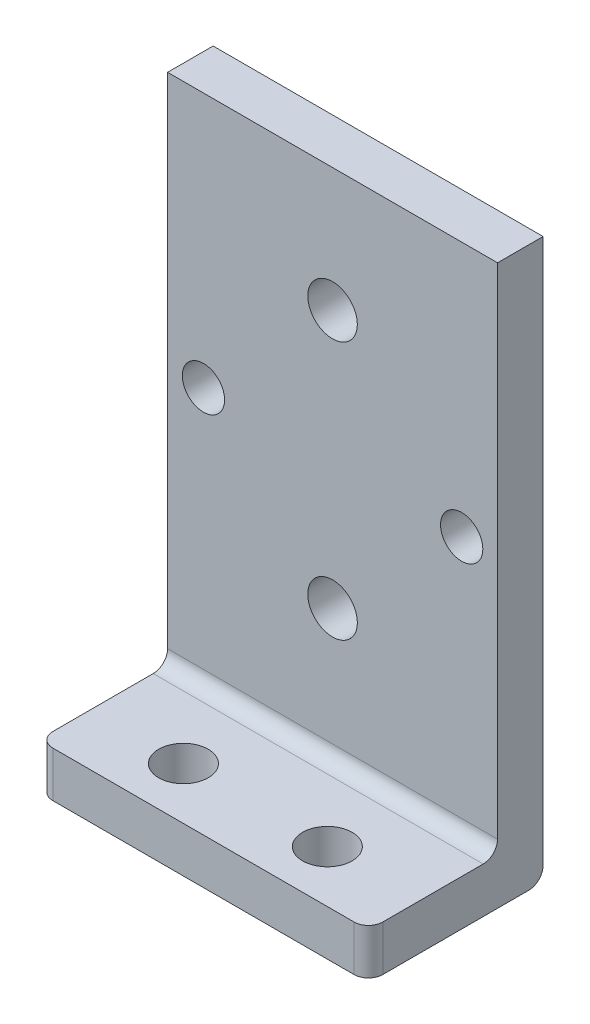
ISO-10303-21;
HEADER;
FILE_DESCRIPTION(('STEP AP214'),'2;1');
FILE_NAME('part.step','',(''),(''),'','','');
FILE_SCHEMA(('AUTOMOTIVE_DESIGN { 1 0 10303 214 1 1 1 1 }'));
ENDSEC;
DATA;
#1=APPLICATION_CONTEXT('core data for automotive mechanical design processes');
#2=APPLICATION_PROTOCOL_DEFINITION('international standard','automotive_design',2000,#1);
#3=PRODUCT_CONTEXT('',#1,'mechanical');
#4=PRODUCT('Part','Part','',(#3));
#5=PRODUCT_RELATED_PRODUCT_CATEGORY('part','',(#4));
#6=PRODUCT_DEFINITION_FORMATION('','',#4);
#7=PRODUCT_DEFINITION_CONTEXT('part definition',#1,'design');
#8=PRODUCT_DEFINITION('design','',#6,#7);
#9=PRODUCT_DEFINITION_SHAPE('','',#8);
#10=(LENGTH_UNIT() NAMED_UNIT(*) SI_UNIT(.MILLI.,.METRE.));
#11=(NAMED_UNIT(*) PLANE_ANGLE_UNIT() SI_UNIT($,.RADIAN.));
#12=(NAMED_UNIT(*) SI_UNIT($,.STERADIAN.) SOLID_ANGLE_UNIT());
#13=UNCERTAINTY_MEASURE_WITH_UNIT(LENGTH_MEASURE(1.E-05),#10,'distance_accuracy_value','');
#14=(GEOMETRIC_REPRESENTATION_CONTEXT(3) GLOBAL_UNCERTAINTY_ASSIGNED_CONTEXT((#13)) GLOBAL_UNIT_ASSIGNED_CONTEXT((#10,
#11,#12)) REPRESENTATION_CONTEXT('',''));
#15=CARTESIAN_POINT('',(0.,0.,0.));
#16=DIRECTION('',(0.,0.,1.));
#17=DIRECTION('',(1.,0.,0.));
#18=AXIS2_PLACEMENT_3D('',#15,#16,#17);
#19=CARTESIAN_POINT('',(23.,0.,3.175));
#20=DIRECTION('',(1.,0.,0.));
#21=DIRECTION('',(0.,1.,0.));
#22=AXIS2_PLACEMENT_3D('',#19,#20,#21);
#23=PLANE('',#22);
#24=DIRECTION('',(0.,0.,-1.));
#25=VECTOR('',#24,1.);
#26=CARTESIAN_POINT('',(23.,-20.,12.175));
#27=LINE('',#26,#25);
#28=CARTESIAN_POINT('',(23.,-20.,11.175));
#29=VERTEX_POINT('',#28);
#30=CARTESIAN_POINT('',(23.,-20.,4.175));
#31=VERTEX_POINT('',#30);
#32=EDGE_CURVE('E165',#29,#31,#27,.T.);
#33=ORIENTED_EDGE('',*,*,#32,.F.);
#34=DIRECTION('',(0.,1.,0.));
#35=VECTOR('',#34,1.);
#36=CARTESIAN_POINT('',(23.,0.,11.175));
#37=LINE('',#36,#35);
#38=CARTESIAN_POINT('',(23.,-23.175,11.175));
#39=VERTEX_POINT('',#38);
#40=EDGE_CURVE('E210',#29,#39,#37,.F.);
#41=ORIENTED_EDGE('',*,*,#40,.T.);
#42=DIRECTION('',(0.,0.,-1.));
#43=VECTOR('',#42,1.);
#44=CARTESIAN_POINT('',(23.,-23.175,3.175));
#45=LINE('',#44,#43);
#46=CARTESIAN_POINT('',(23.,-23.175,1.));
#47=VERTEX_POINT('',#46);
#48=EDGE_CURVE('E162',#39,#47,#45,.T.);
#49=ORIENTED_EDGE('',*,*,#48,.T.);
#50=CARTESIAN_POINT('',(23.,-22.175,1.));
#51=DIRECTION('',(1.,0.,0.));
#52=DIRECTION('',(0.,1.,0.));
#53=AXIS2_PLACEMENT_3D('',#50,#51,#52);
#54=CIRCLE('',#53,1.);
#55=CARTESIAN_POINT('',(23.,-22.175,0.));
#56=VERTEX_POINT('',#55);
#57=EDGE_CURVE('E60',#47,#56,#54,.T.);
#58=ORIENTED_EDGE('',*,*,#57,.T.);
#59=DIRECTION('',(0.,-1.,0.));
#60=VECTOR('',#59,1.);
#61=CARTESIAN_POINT('',(23.,0.,0.));
#62=LINE('',#61,#60);
#63=CARTESIAN_POINT('',(23.,15.7952076860709,0.));
#64=VERTEX_POINT('',#63);
#65=EDGE_CURVE('E125',#64,#56,#62,.T.);
#66=ORIENTED_EDGE('',*,*,#65,.F.);
#67=DIRECTION('',(0.,0.,-1.));
#68=VECTOR('',#67,1.);
#69=CARTESIAN_POINT('',(23.,15.7952076860709,3.175));
#70=LINE('',#69,#68);
#71=CARTESIAN_POINT('',(23.,15.7952076860709,3.175));
#72=VERTEX_POINT('',#71);
#73=EDGE_CURVE('E120',#72,#64,#70,.T.);
#74=ORIENTED_EDGE('',*,*,#73,.F.);
#75=DIRECTION('',(0.,-1.,0.));
#76=VECTOR('',#75,1.);
#77=CARTESIAN_POINT('',(23.,0.,3.175));
#78=LINE('',#77,#76);
#79=CARTESIAN_POINT('',(23.,-19.,3.175));
#80=VERTEX_POINT('',#79);
#81=EDGE_CURVE('E123',#72,#80,#78,.T.);
#82=ORIENTED_EDGE('',*,*,#81,.T.);
#83=CARTESIAN_POINT('',(23.,-19.,4.175));
#84=DIRECTION('',(1.,0.,0.));
#85=DIRECTION('',(0.,1.,0.));
#86=AXIS2_PLACEMENT_3D('',#83,#84,#85);
#87=CIRCLE('',#86,1.);
#88=EDGE_CURVE('E11',#80,#31,#87,.F.);
#89=ORIENTED_EDGE('',*,*,#88,.T.);
#90=EDGE_LOOP('',(#33,#41,#49,#58,#66,#74,#82,#89));
#91=FACE_BOUND('',#90,.T.);
#92=ADVANCED_FACE('F45',(#91),#23,.T.);
#93=CARTESIAN_POINT('',(0.,15.7952076860709,3.175));
#94=DIRECTION('',(0.,1.,0.));
#95=DIRECTION('',(0.,0.,1.));
#96=AXIS2_PLACEMENT_3D('',#93,#94,#95);
#97=PLANE('',#96);
#98=DIRECTION('',(1.,0.,0.));
#99=VECTOR('',#98,1.);
#100=CARTESIAN_POINT('',(0.,15.7952076860709,0.));
#101=LINE('',#100,#99);
#102=CARTESIAN_POINT('',(0.,15.7952076860709,0.));
#103=VERTEX_POINT('',#102);
#104=EDGE_CURVE('E164',#103,#64,#101,.T.);
#105=ORIENTED_EDGE('',*,*,#104,.F.);
#106=DIRECTION('',(0.,0.,-1.));
#107=VECTOR('',#106,1.);
#108=CARTESIAN_POINT('',(0.,15.7952076860709,3.175));
#109=LINE('',#108,#107);
#110=CARTESIAN_POINT('',(0.,15.7952076860709,3.175));
#111=VERTEX_POINT('',#110);
#112=EDGE_CURVE('E131',#111,#103,#109,.T.);
#113=ORIENTED_EDGE('',*,*,#112,.F.);
#114=DIRECTION('',(1.,0.,0.));
#115=VECTOR('',#114,1.);
#116=CARTESIAN_POINT('',(0.,15.7952076860709,3.175));
#117=LINE('',#116,#115);
#118=EDGE_CURVE('E138',#111,#72,#117,.T.);
#119=ORIENTED_EDGE('',*,*,#118,.T.);
#120=ORIENTED_EDGE('',*,*,#73,.T.);
#121=EDGE_LOOP('',(#105,#113,#119,#120));
#122=FACE_BOUND('',#121,.T.);
#123=ADVANCED_FACE('F143',(#122),#97,.T.);
#124=CARTESIAN_POINT('',(0.,0.,3.175));
#125=DIRECTION('',(1.,0.,0.));
#126=DIRECTION('',(0.,1.,0.));
#127=AXIS2_PLACEMENT_3D('',#124,#125,#126);
#128=PLANE('',#127);
#129=DIRECTION('',(0.,0.,-1.));
#130=VECTOR('',#129,1.);
#131=CARTESIAN_POINT('',(0.,-23.175,3.175));
#132=LINE('',#131,#130);
#133=CARTESIAN_POINT('',(0.,-23.175,11.175));
#134=VERTEX_POINT('',#133);
#135=CARTESIAN_POINT('',(0.,-23.175,1.));
#136=VERTEX_POINT('',#135);
#137=EDGE_CURVE('E182',#134,#136,#132,.T.);
#138=ORIENTED_EDGE('',*,*,#137,.F.);
#139=DIRECTION('',(0.,1.,0.));
#140=VECTOR('',#139,1.);
#141=CARTESIAN_POINT('',(0.,-20.,11.175));
#142=LINE('',#141,#140);
#143=CARTESIAN_POINT('',(0.,-20.,11.175));
#144=VERTEX_POINT('',#143);
#145=EDGE_CURVE('E195',#134,#144,#142,.T.);
#146=ORIENTED_EDGE('',*,*,#145,.T.);
#147=DIRECTION('',(0.,0.,-1.));
#148=VECTOR('',#147,1.);
#149=CARTESIAN_POINT('',(0.,-20.,12.175));
#150=LINE('',#149,#148);
#151=CARTESIAN_POINT('',(0.,-20.,4.175));
#152=VERTEX_POINT('',#151);
#153=EDGE_CURVE('E218',#144,#152,#150,.T.);
#154=ORIENTED_EDGE('',*,*,#153,.T.);
#155=CARTESIAN_POINT('',(0.,-19.,4.175));
#156=DIRECTION('',(1.,0.,0.));
#157=DIRECTION('',(0.,1.,0.));
#158=AXIS2_PLACEMENT_3D('',#155,#156,#157);
#159=CIRCLE('',#158,1.);
#160=CARTESIAN_POINT('',(0.,-19.,3.175));
#161=VERTEX_POINT('',#160);
#162=EDGE_CURVE('E53',#152,#161,#159,.T.);
#163=ORIENTED_EDGE('',*,*,#162,.T.);
#164=DIRECTION('',(0.,-1.,0.));
#165=VECTOR('',#164,1.);
#166=CARTESIAN_POINT('',(0.,0.,3.175));
#167=LINE('',#166,#165);
#168=EDGE_CURVE('E145',#111,#161,#167,.T.);
#169=ORIENTED_EDGE('',*,*,#168,.F.);
#170=ORIENTED_EDGE('',*,*,#112,.T.);
#171=DIRECTION('',(0.,-1.,0.));
#172=VECTOR('',#171,1.);
#173=CARTESIAN_POINT('',(0.,0.,0.));
#174=LINE('',#173,#172);
#175=CARTESIAN_POINT('',(0.,-22.175,0.));
#176=VERTEX_POINT('',#175);
#177=EDGE_CURVE('E167',#103,#176,#174,.T.);
#178=ORIENTED_EDGE('',*,*,#177,.T.);
#179=CARTESIAN_POINT('',(0.,-22.175,1.));
#180=DIRECTION('',(1.,0.,0.));
#181=DIRECTION('',(0.,1.,0.));
#182=AXIS2_PLACEMENT_3D('',#179,#180,#181);
#183=CIRCLE('',#182,1.);
#184=EDGE_CURVE('E193',#176,#136,#183,.F.);
#185=ORIENTED_EDGE('',*,*,#184,.T.);
#186=EDGE_LOOP('',(#138,#146,#154,#163,#169,#170,#178,#185));
#187=FACE_BOUND('',#186,.T.);
#188=ADVANCED_FACE('F216',(#187),#128,.F.);
#189=CARTESIAN_POINT('',(2.5,-2.,3.175));
#190=DIRECTION('',(0.,0.,-1.));
#191=DIRECTION('',(-1.,0.,0.));
#192=AXIS2_PLACEMENT_3D('',#189,#190,#191);
#193=CYLINDRICAL_SURFACE('',#192,1.4732);
#194=CARTESIAN_POINT('',(2.5,-2.,3.175));
#195=DIRECTION('',(0.,0.,1.));
#196=DIRECTION('',(1.,0.,0.));
#197=AXIS2_PLACEMENT_3D('',#194,#195,#196);
#198=CIRCLE('',#197,1.4732);
#199=CARTESIAN_POINT('',(3.9732,-2.,3.175));
#200=VERTEX_POINT('',#199);
#201=EDGE_CURVE('E156',#200,#200,#198,.T.);
#202=ORIENTED_EDGE('',*,*,#201,.T.);
#203=EDGE_LOOP('',(#202));
#204=FACE_BOUND('',#203,.T.);
#205=CARTESIAN_POINT('',(2.5,-2.,0.));
#206=DIRECTION('',(0.,0.,1.));
#207=DIRECTION('',(1.,0.,0.));
#208=AXIS2_PLACEMENT_3D('',#205,#206,#207);
#209=CIRCLE('',#208,1.4732);
#210=CARTESIAN_POINT('',(3.9732,-2.,0.));
#211=VERTEX_POINT('',#210);
#212=EDGE_CURVE('E176',#211,#211,#209,.T.);
#213=ORIENTED_EDGE('',*,*,#212,.F.);
#214=EDGE_LOOP('',(#213));
#215=FACE_BOUND('',#214,.T.);
#216=ADVANCED_FACE('F325',(#204,#215),#193,.F.);
#217=CARTESIAN_POINT('',(20.5,-2.,3.175));
#218=DIRECTION('',(0.,0.,-1.));
#219=DIRECTION('',(-1.,0.,0.));
#220=AXIS2_PLACEMENT_3D('',#217,#218,#219);
#221=CYLINDRICAL_SURFACE('',#220,1.4732);
#222=CARTESIAN_POINT('',(20.5,-2.,3.175));
#223=DIRECTION('',(0.,0.,1.));
#224=DIRECTION('',(1.,0.,0.));
#225=AXIS2_PLACEMENT_3D('',#222,#223,#224);
#226=CIRCLE('',#225,1.4732);
#227=CARTESIAN_POINT('',(21.9732,-2.,3.175));
#228=VERTEX_POINT('',#227);
#229=EDGE_CURVE('E153',#228,#228,#226,.T.);
#230=ORIENTED_EDGE('',*,*,#229,.T.);
#231=EDGE_LOOP('',(#230));
#232=FACE_BOUND('',#231,.T.);
#233=CARTESIAN_POINT('',(20.5,-2.,0.));
#234=DIRECTION('',(0.,0.,1.));
#235=DIRECTION('',(1.,0.,0.));
#236=AXIS2_PLACEMENT_3D('',#233,#234,#235);
#237=CIRCLE('',#236,1.4732);
#238=CARTESIAN_POINT('',(21.9732,-2.,0.));
#239=VERTEX_POINT('',#238);
#240=EDGE_CURVE('E173',#239,#239,#237,.T.);
#241=ORIENTED_EDGE('',*,*,#240,.F.);
#242=EDGE_LOOP('',(#241));
#243=FACE_BOUND('',#242,.T.);
#244=ADVANCED_FACE('F328',(#232,#243),#221,.F.);
#245=CARTESIAN_POINT('',(11.5,-10.8179043102955,3.175));
#246=DIRECTION('',(0.,0.,-1.));
#247=DIRECTION('',(-1.,0.,0.));
#248=AXIS2_PLACEMENT_3D('',#245,#246,#247);
#249=CYLINDRICAL_SURFACE('',#248,1.7272);
#250=CARTESIAN_POINT('',(11.5,-10.8179043102955,3.175));
#251=DIRECTION('',(0.,0.,1.));
#252=DIRECTION('',(1.,0.,0.));
#253=AXIS2_PLACEMENT_3D('',#250,#251,#252);
#254=CIRCLE('',#253,1.7272);
#255=CARTESIAN_POINT('',(13.2272,-10.8179043102955,3.175));
#256=VERTEX_POINT('',#255);
#257=EDGE_CURVE('E147',#256,#256,#254,.T.);
#258=ORIENTED_EDGE('',*,*,#257,.T.);
#259=EDGE_LOOP('',(#258));
#260=FACE_BOUND('',#259,.T.);
#261=CARTESIAN_POINT('',(11.5,-10.8179043102955,0.));
#262=DIRECTION('',(0.,0.,1.));
#263=DIRECTION('',(1.,0.,0.));
#264=AXIS2_PLACEMENT_3D('',#261,#262,#263);
#265=CIRCLE('',#264,1.7272);
#266=CARTESIAN_POINT('',(13.2272,-10.8179043102955,0.));
#267=VERTEX_POINT('',#266);
#268=EDGE_CURVE('E170',#267,#267,#265,.T.);
#269=ORIENTED_EDGE('',*,*,#268,.F.);
#270=EDGE_LOOP('',(#269));
#271=FACE_BOUND('',#270,.T.);
#272=ADVANCED_FACE('F321',(#260,#271),#249,.F.);
#273=CARTESIAN_POINT('',(0.,-23.175,3.175));
#274=DIRECTION('',(0.,1.,0.));
#275=DIRECTION('',(0.,0.,1.));
#276=AXIS2_PLACEMENT_3D('',#273,#274,#275);
#277=PLANE('',#276);
#278=CARTESIAN_POINT('',(6.4835,-23.175,8.5555));
#279=DIRECTION('',(0.,1.,0.));
#280=DIRECTION('',(0.,0.,1.));
#281=AXIS2_PLACEMENT_3D('',#278,#279,#280);
#282=CIRCLE('',#281,1.7272);
#283=CARTESIAN_POINT('',(6.4835,-23.175,10.2827));
#284=VERTEX_POINT('',#283);
#285=EDGE_CURVE('E241',#284,#284,#282,.T.);
#286=ORIENTED_EDGE('',*,*,#285,.T.);
#287=EDGE_LOOP('',(#286));
#288=FACE_BOUND('',#287,.T.);
#289=CARTESIAN_POINT('',(16.5165,-23.175,8.5555));
#290=DIRECTION('',(0.,1.,0.));
#291=DIRECTION('',(0.,0.,1.));
#292=AXIS2_PLACEMENT_3D('',#289,#290,#291);
#293=CIRCLE('',#292,1.7272);
#294=CARTESIAN_POINT('',(16.5165,-23.175,10.2827));
#295=VERTEX_POINT('',#294);
#296=EDGE_CURVE('E235',#295,#295,#293,.T.);
#297=ORIENTED_EDGE('',*,*,#296,.T.);
#298=EDGE_LOOP('',(#297));
#299=FACE_BOUND('',#298,.T.);
#300=DIRECTION('',(-1.,0.,0.));
#301=VECTOR('',#300,1.);
#302=CARTESIAN_POINT('',(0.,-23.175,12.175));
#303=LINE('',#302,#301);
#304=CARTESIAN_POINT('',(22.,-23.175,12.175));
#305=VERTEX_POINT('',#304);
#306=CARTESIAN_POINT('',(1.,-23.175,12.175));
#307=VERTEX_POINT('',#306);
#308=EDGE_CURVE('E228',#305,#307,#303,.T.);
#309=ORIENTED_EDGE('',*,*,#308,.T.);
#310=CARTESIAN_POINT('',(1.,-23.175,11.175));
#311=DIRECTION('',(0.,1.,0.));
#312=DIRECTION('',(0.,0.,1.));
#313=AXIS2_PLACEMENT_3D('',#310,#311,#312);
#314=CIRCLE('',#313,1.);
#315=EDGE_CURVE('E207',#307,#134,#314,.F.);
#316=ORIENTED_EDGE('',*,*,#315,.T.);
#317=ORIENTED_EDGE('',*,*,#137,.T.);
#318=DIRECTION('',(1.,0.,0.));
#319=VECTOR('',#318,1.);
#320=CARTESIAN_POINT('',(0.,-23.175,1.));
#321=LINE('',#320,#319);
#322=EDGE_CURVE('E203',#136,#47,#321,.T.);
#323=ORIENTED_EDGE('',*,*,#322,.T.);
#324=ORIENTED_EDGE('',*,*,#48,.F.);
#325=CARTESIAN_POINT('',(22.,-23.175,11.175));
#326=DIRECTION('',(0.,1.,0.));
#327=DIRECTION('',(0.,0.,1.));
#328=AXIS2_PLACEMENT_3D('',#325,#326,#327);
#329=CIRCLE('',#328,1.);
#330=EDGE_CURVE('E205',#39,#305,#329,.F.);
#331=ORIENTED_EDGE('',*,*,#330,.T.);
#332=EDGE_LOOP('',(#309,#316,#317,#323,#324,#331));
#333=FACE_BOUND('',#332,.T.);
#334=ADVANCED_FACE('F294',(#288,#299,#333),#277,.F.);
#335=CARTESIAN_POINT('',(11.5,7.18209568970453,3.175));
#336=DIRECTION('',(0.,0.,-1.));
#337=DIRECTION('',(-1.,0.,0.));
#338=AXIS2_PLACEMENT_3D('',#335,#336,#337);
#339=CYLINDRICAL_SURFACE('',#338,1.7272);
#340=CARTESIAN_POINT('',(11.5,7.18209568970453,3.175));
#341=DIRECTION('',(0.,0.,1.));
#342=DIRECTION('',(1.,0.,0.));
#343=AXIS2_PLACEMENT_3D('',#340,#341,#342);
#344=CIRCLE('',#343,1.7272);
#345=CARTESIAN_POINT('',(13.2272,7.18209568970453,3.175));
#346=VERTEX_POINT('',#345);
#347=EDGE_CURVE('E159',#346,#346,#344,.T.);
#348=ORIENTED_EDGE('',*,*,#347,.T.);
#349=EDGE_LOOP('',(#348));
#350=FACE_BOUND('',#349,.T.);
#351=CARTESIAN_POINT('',(11.5,7.18209568970453,0.));
#352=DIRECTION('',(0.,0.,1.));
#353=DIRECTION('',(1.,0.,0.));
#354=AXIS2_PLACEMENT_3D('',#351,#352,#353);
#355=CIRCLE('',#354,1.7272);
#356=CARTESIAN_POINT('',(13.2272,7.18209568970453,0.));
#357=VERTEX_POINT('',#356);
#358=EDGE_CURVE('E141',#357,#357,#355,.T.);
#359=ORIENTED_EDGE('',*,*,#358,.F.);
#360=EDGE_LOOP('',(#359));
#361=FACE_BOUND('',#360,.T.);
#362=ADVANCED_FACE('F312',(#350,#361),#339,.F.);
#363=CARTESIAN_POINT('',(0.,0.,3.175));
#364=DIRECTION('',(0.,0.,1.));
#365=DIRECTION('',(1.,0.,0.));
#366=AXIS2_PLACEMENT_3D('',#363,#364,#365);
#367=PLANE('',#366);
#368=ORIENTED_EDGE('',*,*,#168,.T.);
#369=DIRECTION('',(-1.,0.,0.));
#370=VECTOR('',#369,1.);
#371=CARTESIAN_POINT('',(0.,-19.,3.175));
#372=LINE('',#371,#370);
#373=EDGE_CURVE('E140',#161,#80,#372,.F.);
#374=ORIENTED_EDGE('',*,*,#373,.T.);
#375=ORIENTED_EDGE('',*,*,#81,.F.);
#376=ORIENTED_EDGE('',*,*,#118,.F.);
#377=EDGE_LOOP('',(#368,#374,#375,#376));
#378=FACE_BOUND('',#377,.T.);
#379=ORIENTED_EDGE('',*,*,#257,.F.);
#380=EDGE_LOOP('',(#379));
#381=FACE_BOUND('',#380,.T.);
#382=ORIENTED_EDGE('',*,*,#229,.F.);
#383=EDGE_LOOP('',(#382));
#384=FACE_BOUND('',#383,.T.);
#385=ORIENTED_EDGE('',*,*,#201,.F.);
#386=EDGE_LOOP('',(#385));
#387=FACE_BOUND('',#386,.T.);
#388=ORIENTED_EDGE('',*,*,#347,.F.);
#389=EDGE_LOOP('',(#388));
#390=FACE_BOUND('',#389,.T.);
#391=ADVANCED_FACE('F136',(#378,#381,#384,#387,#390),#367,.T.);
#392=CARTESIAN_POINT('',(0.,0.,0.));
#393=DIRECTION('',(0.,0.,1.));
#394=DIRECTION('',(1.,0.,0.));
#395=AXIS2_PLACEMENT_3D('',#392,#393,#394);
#396=PLANE('',#395);
#397=ORIENTED_EDGE('',*,*,#65,.T.);
#398=DIRECTION('',(1.,0.,0.));
#399=VECTOR('',#398,1.);
#400=CARTESIAN_POINT('',(0.,-22.175,0.));
#401=LINE('',#400,#399);
#402=EDGE_CURVE('E212',#56,#176,#401,.F.);
#403=ORIENTED_EDGE('',*,*,#402,.T.);
#404=ORIENTED_EDGE('',*,*,#177,.F.);
#405=ORIENTED_EDGE('',*,*,#104,.T.);
#406=EDGE_LOOP('',(#397,#403,#404,#405));
#407=FACE_BOUND('',#406,.T.);
#408=ORIENTED_EDGE('',*,*,#268,.T.);
#409=EDGE_LOOP('',(#408));
#410=FACE_BOUND('',#409,.T.);
#411=ORIENTED_EDGE('',*,*,#240,.T.);
#412=EDGE_LOOP('',(#411));
#413=FACE_BOUND('',#412,.T.);
#414=ORIENTED_EDGE('',*,*,#212,.T.);
#415=EDGE_LOOP('',(#414));
#416=FACE_BOUND('',#415,.T.);
#417=ORIENTED_EDGE('',*,*,#358,.T.);
#418=EDGE_LOOP('',(#417));
#419=FACE_BOUND('',#418,.T.);
#420=ADVANCED_FACE('F253',(#407,#410,#413,#416,#419),#396,.F.);
#421=CARTESIAN_POINT('',(0.,-20.,12.175));
#422=DIRECTION('',(0.,-1.,0.));
#423=DIRECTION('',(1.,0.,0.));
#424=AXIS2_PLACEMENT_3D('',#421,#422,#423);
#425=PLANE('',#424);
#426=CARTESIAN_POINT('',(6.4835,-20.,8.5555));
#427=DIRECTION('',(0.,1.,0.));
#428=DIRECTION('',(0.,0.,1.));
#429=AXIS2_PLACEMENT_3D('',#426,#427,#428);
#430=CIRCLE('',#429,1.7272);
#431=CARTESIAN_POINT('',(6.4835,-20.,10.2827));
#432=VERTEX_POINT('',#431);
#433=EDGE_CURVE('E244',#432,#432,#430,.T.);
#434=ORIENTED_EDGE('',*,*,#433,.F.);
#435=EDGE_LOOP('',(#434));
#436=FACE_BOUND('',#435,.T.);
#437=CARTESIAN_POINT('',(16.5165,-20.,8.5555));
#438=DIRECTION('',(0.,1.,0.));
#439=DIRECTION('',(0.,0.,1.));
#440=AXIS2_PLACEMENT_3D('',#437,#438,#439);
#441=CIRCLE('',#440,1.7272);
#442=CARTESIAN_POINT('',(16.5165,-20.,10.2827));
#443=VERTEX_POINT('',#442);
#444=EDGE_CURVE('E238',#443,#443,#441,.T.);
#445=ORIENTED_EDGE('',*,*,#444,.F.);
#446=EDGE_LOOP('',(#445));
#447=FACE_BOUND('',#446,.T.);
#448=ORIENTED_EDGE('',*,*,#32,.T.);
#449=DIRECTION('',(-1.,0.,0.));
#450=VECTOR('',#449,1.);
#451=CARTESIAN_POINT('',(0.,-20.,4.175));
#452=LINE('',#451,#450);
#453=EDGE_CURVE('E189',#31,#152,#452,.T.);
#454=ORIENTED_EDGE('',*,*,#453,.T.);
#455=ORIENTED_EDGE('',*,*,#153,.F.);
#456=CARTESIAN_POINT('',(1.,-20.,11.175));
#457=DIRECTION('',(0.,-1.,0.));
#458=DIRECTION('',(1.,0.,0.));
#459=AXIS2_PLACEMENT_3D('',#456,#457,#458);
#460=CIRCLE('',#459,1.);
#461=CARTESIAN_POINT('',(1.,-20.,12.175));
#462=VERTEX_POINT('',#461);
#463=EDGE_CURVE('E187',#144,#462,#460,.F.);
#464=ORIENTED_EDGE('',*,*,#463,.T.);
#465=DIRECTION('',(-1.,0.,0.));
#466=VECTOR('',#465,1.);
#467=CARTESIAN_POINT('',(0.,-20.,12.175));
#468=LINE('',#467,#466);
#469=CARTESIAN_POINT('',(22.,-20.,12.175));
#470=VERTEX_POINT('',#469);
#471=EDGE_CURVE('E232',#470,#462,#468,.T.);
#472=ORIENTED_EDGE('',*,*,#471,.F.);
#473=CARTESIAN_POINT('',(22.,-20.,11.175));
#474=DIRECTION('',(0.,-1.,0.));
#475=DIRECTION('',(1.,0.,0.));
#476=AXIS2_PLACEMENT_3D('',#473,#474,#475);
#477=CIRCLE('',#476,1.);
#478=EDGE_CURVE('E130',#470,#29,#477,.F.);
#479=ORIENTED_EDGE('',*,*,#478,.T.);
#480=EDGE_LOOP('',(#448,#454,#455,#464,#472,#479));
#481=FACE_BOUND('',#480,.T.);
#482=ADVANCED_FACE('F225',(#436,#447,#481),#425,.F.);
#483=CARTESIAN_POINT('',(0.,0.,12.175));
#484=DIRECTION('',(0.,0.,1.));
#485=DIRECTION('',(1.,0.,0.));
#486=AXIS2_PLACEMENT_3D('',#483,#484,#485);
#487=PLANE('',#486);
#488=ORIENTED_EDGE('',*,*,#471,.T.);
#489=DIRECTION('',(0.,1.,0.));
#490=VECTOR('',#489,1.);
#491=CARTESIAN_POINT('',(1.,-23.175,12.175));
#492=LINE('',#491,#490);
#493=EDGE_CURVE('E201',#462,#307,#492,.F.);
#494=ORIENTED_EDGE('',*,*,#493,.T.);
#495=ORIENTED_EDGE('',*,*,#308,.F.);
#496=DIRECTION('',(0.,1.,0.));
#497=VECTOR('',#496,1.);
#498=CARTESIAN_POINT('',(22.,0.,12.175));
#499=LINE('',#498,#497);
#500=EDGE_CURVE('E198',#305,#470,#499,.T.);
#501=ORIENTED_EDGE('',*,*,#500,.T.);
#502=EDGE_LOOP('',(#488,#494,#495,#501));
#503=FACE_BOUND('',#502,.T.);
#504=ADVANCED_FACE('F252',(#503),#487,.T.);
#505=CARTESIAN_POINT('',(16.5165,-20.,8.5555));
#506=DIRECTION('',(0.,1.,0.));
#507=DIRECTION('',(0.,0.,1.));
#508=AXIS2_PLACEMENT_3D('',#505,#506,#507);
#509=CYLINDRICAL_SURFACE('',#508,1.7272);
#510=ORIENTED_EDGE('',*,*,#296,.F.);
#511=EDGE_LOOP('',(#510));
#512=FACE_BOUND('',#511,.T.);
#513=ORIENTED_EDGE('',*,*,#444,.T.);
#514=EDGE_LOOP('',(#513));
#515=FACE_BOUND('',#514,.T.);
#516=ADVANCED_FACE('F257',(#512,#515),#509,.F.);
#517=CARTESIAN_POINT('',(6.4835,-20.,8.5555));
#518=DIRECTION('',(0.,1.,0.));
#519=DIRECTION('',(0.,0.,1.));
#520=AXIS2_PLACEMENT_3D('',#517,#518,#519);
#521=CYLINDRICAL_SURFACE('',#520,1.7272);
#522=ORIENTED_EDGE('',*,*,#285,.F.);
#523=EDGE_LOOP('',(#522));
#524=FACE_BOUND('',#523,.T.);
#525=ORIENTED_EDGE('',*,*,#433,.T.);
#526=EDGE_LOOP('',(#525));
#527=FACE_BOUND('',#526,.T.);
#528=ADVANCED_FACE('F248',(#524,#527),#521,.F.);
#529=CARTESIAN_POINT('',(0.,-19.,4.175));
#530=DIRECTION('',(-1.,0.,0.));
#531=DIRECTION('',(0.,-1.,0.));
#532=AXIS2_PLACEMENT_3D('',#529,#530,#531);
#533=CYLINDRICAL_SURFACE('',#532,1.);
#534=ORIENTED_EDGE('',*,*,#88,.F.);
#535=ORIENTED_EDGE('',*,*,#373,.F.);
#536=ORIENTED_EDGE('',*,*,#162,.F.);
#537=ORIENTED_EDGE('',*,*,#453,.F.);
#538=EDGE_LOOP('',(#534,#535,#536,#537));
#539=FACE_BOUND('',#538,.T.);
#540=ADVANCED_FACE('F221',(#539),#533,.F.);
#541=CARTESIAN_POINT('',(1.,0.,11.175));
#542=DIRECTION('',(0.,-1.,0.));
#543=DIRECTION('',(1.,0.,0.));
#544=AXIS2_PLACEMENT_3D('',#541,#542,#543);
#545=CYLINDRICAL_SURFACE('',#544,1.);
#546=ORIENTED_EDGE('',*,*,#315,.F.);
#547=ORIENTED_EDGE('',*,*,#493,.F.);
#548=ORIENTED_EDGE('',*,*,#463,.F.);
#549=ORIENTED_EDGE('',*,*,#145,.F.);
#550=EDGE_LOOP('',(#546,#547,#548,#549));
#551=FACE_BOUND('',#550,.T.);
#552=ADVANCED_FACE('F280',(#551),#545,.T.);
#553=CARTESIAN_POINT('',(22.,0.,11.175));
#554=DIRECTION('',(0.,1.,0.));
#555=DIRECTION('',(-1.,0.,0.));
#556=AXIS2_PLACEMENT_3D('',#553,#554,#555);
#557=CYLINDRICAL_SURFACE('',#556,1.);
#558=ORIENTED_EDGE('',*,*,#330,.F.);
#559=ORIENTED_EDGE('',*,*,#40,.F.);
#560=ORIENTED_EDGE('',*,*,#478,.F.);
#561=ORIENTED_EDGE('',*,*,#500,.F.);
#562=EDGE_LOOP('',(#558,#559,#560,#561));
#563=FACE_BOUND('',#562,.T.);
#564=ADVANCED_FACE('F282',(#563),#557,.T.);
#565=CARTESIAN_POINT('',(0.,-22.175,1.));
#566=DIRECTION('',(1.,0.,0.));
#567=DIRECTION('',(0.,0.,-1.));
#568=AXIS2_PLACEMENT_3D('',#565,#566,#567);
#569=CYLINDRICAL_SURFACE('',#568,1.);
#570=ORIENTED_EDGE('',*,*,#184,.F.);
#571=ORIENTED_EDGE('',*,*,#402,.F.);
#572=ORIENTED_EDGE('',*,*,#57,.F.);
#573=ORIENTED_EDGE('',*,*,#322,.F.);
#574=EDGE_LOOP('',(#570,#571,#572,#573));
#575=FACE_BOUND('',#574,.T.);
#576=ADVANCED_FACE('F47',(#575),#569,.T.);
#577=CLOSED_SHELL('',(#92,#123,#188,#216,#244,#272,#334,#362,#391,#420,#482,#504,#516,#528,#540,
#552,#564,#576));
#578=MANIFOLD_SOLID_BREP('B2',#577);
#579=ADVANCED_BREP_SHAPE_REPRESENTATION('',(#18,#578),#14);
#580=SHAPE_DEFINITION_REPRESENTATION(#9,#579);
ENDSEC;
END-ISO-10303-21;
